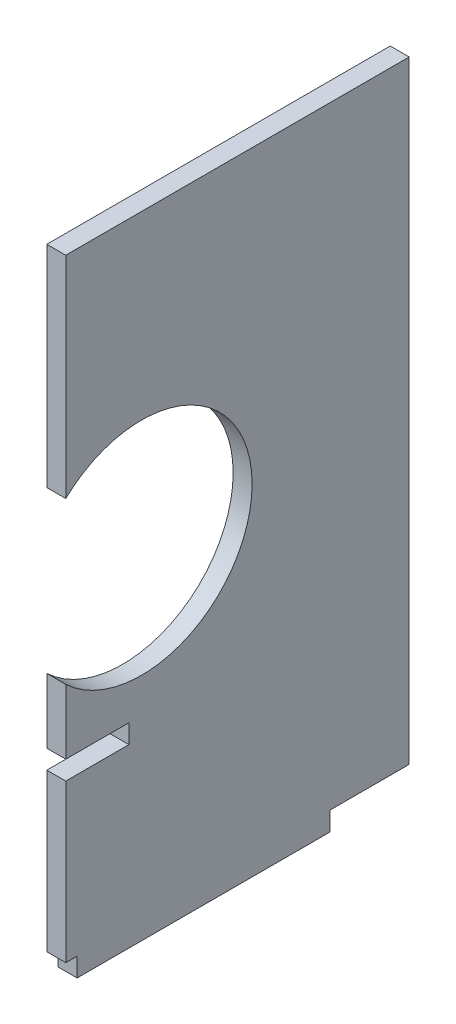
ISO-10303-21;
HEADER;
FILE_DESCRIPTION(('STEP AP214'),'2;1');
FILE_NAME('part.step','',(''),(''),'','','');
FILE_SCHEMA(('AUTOMOTIVE_DESIGN { 1 0 10303 214 1 1 1 1 }'));
ENDSEC;
DATA;
#1=APPLICATION_CONTEXT('core data for automotive mechanical design processes');
#2=APPLICATION_PROTOCOL_DEFINITION('international standard','automotive_design',2000,#1);
#3=PRODUCT_CONTEXT('',#1,'mechanical');
#4=PRODUCT('Part','Part','',(#3));
#5=PRODUCT_RELATED_PRODUCT_CATEGORY('part','',(#4));
#6=PRODUCT_DEFINITION_FORMATION('','',#4);
#7=PRODUCT_DEFINITION_CONTEXT('part definition',#1,'design');
#8=PRODUCT_DEFINITION('design','',#6,#7);
#9=PRODUCT_DEFINITION_SHAPE('','',#8);
#10=(LENGTH_UNIT() NAMED_UNIT(*) SI_UNIT(.MILLI.,.METRE.));
#11=(NAMED_UNIT(*) PLANE_ANGLE_UNIT() SI_UNIT($,.RADIAN.));
#12=(NAMED_UNIT(*) SI_UNIT($,.STERADIAN.) SOLID_ANGLE_UNIT());
#13=UNCERTAINTY_MEASURE_WITH_UNIT(LENGTH_MEASURE(1.E-05),#10,'distance_accuracy_value','');
#14=(GEOMETRIC_REPRESENTATION_CONTEXT(3) GLOBAL_UNCERTAINTY_ASSIGNED_CONTEXT((#13)) GLOBAL_UNIT_ASSIGNED_CONTEXT((#10,
#11,#12)) REPRESENTATION_CONTEXT('',''));
#15=CARTESIAN_POINT('',(0.,0.,0.));
#16=DIRECTION('',(0.,0.,1.));
#17=DIRECTION('',(1.,0.,0.));
#18=AXIS2_PLACEMENT_3D('',#15,#16,#17);
#19=CARTESIAN_POINT('',(3.,-9.42654711631269,59.4756555054512));
#20=DIRECTION('',(0.,-1.,0.));
#21=DIRECTION('',(0.,0.,-1.));
#22=AXIS2_PLACEMENT_3D('',#19,#20,#21);
#23=PLANE('',#22);
#24=DIRECTION('',(0.,0.,1.));
#25=VECTOR('',#24,1.);
#26=CARTESIAN_POINT('',(0.,-9.42654711631269,59.4756555054512));
#27=LINE('',#26,#25);
#28=CARTESIAN_POINT('',(0.,-9.42654711631268,5.10565550545122));
#29=VERTEX_POINT('',#28);
#30=CARTESIAN_POINT('',(0.,-9.42654711631269,59.4756555054512));
#31=VERTEX_POINT('',#30);
#32=EDGE_CURVE('E153',#29,#31,#27,.T.);
#33=ORIENTED_EDGE('',*,*,#32,.T.);
#34=DIRECTION('',(-1.,0.,0.));
#35=VECTOR('',#34,1.);
#36=CARTESIAN_POINT('',(3.,-9.42654711631269,59.4756555054512));
#37=LINE('',#36,#35);
#38=CARTESIAN_POINT('',(3.,-9.42654711631269,59.4756555054512));
#39=VERTEX_POINT('',#38);
#40=EDGE_CURVE('E9',#39,#31,#37,.T.);
#41=ORIENTED_EDGE('',*,*,#40,.F.);
#42=DIRECTION('',(0.,0.,1.));
#43=VECTOR('',#42,1.);
#44=CARTESIAN_POINT('',(3.,-9.42654711631269,59.4756555054512));
#45=LINE('',#44,#43);
#46=CARTESIAN_POINT('',(3.,-9.42654711631268,5.10565550545122));
#47=VERTEX_POINT('',#46);
#48=EDGE_CURVE('E147',#47,#39,#45,.T.);
#49=ORIENTED_EDGE('',*,*,#48,.F.);
#50=DIRECTION('',(-1.,0.,0.));
#51=VECTOR('',#50,1.);
#52=CARTESIAN_POINT('',(3.,-9.42654711631268,5.10565550545122));
#53=LINE('',#52,#51);
#54=EDGE_CURVE('E143',#47,#29,#53,.T.);
#55=ORIENTED_EDGE('',*,*,#54,.T.);
#56=EDGE_LOOP('',(#33,#41,#49,#55));
#57=FACE_BOUND('',#56,.T.);
#58=ADVANCED_FACE('F15',(#57),#23,.F.);
#59=CARTESIAN_POINT('',(3.,-42.7888079134557,59.4756555054512));
#60=DIRECTION('',(0.,0.,-1.));
#61=DIRECTION('',(0.,1.,0.));
#62=AXIS2_PLACEMENT_3D('',#59,#60,#61);
#63=PLANE('',#62);
#64=DIRECTION('',(0.,-1.,0.));
#65=VECTOR('',#64,1.);
#66=CARTESIAN_POINT('',(0.,-42.7888079134557,59.4756555054512));
#67=LINE('',#66,#65);
#68=CARTESIAN_POINT('',(0.,-42.7888079134557,59.4756555054512));
#69=VERTEX_POINT('',#68);
#70=EDGE_CURVE('E149',#31,#69,#67,.T.);
#71=ORIENTED_EDGE('',*,*,#70,.T.);
#72=DIRECTION('',(-1.,0.,0.));
#73=VECTOR('',#72,1.);
#74=CARTESIAN_POINT('',(3.,-42.7888079134557,59.4756555054512));
#75=LINE('',#74,#73);
#76=CARTESIAN_POINT('',(3.,-42.7888079134557,59.4756555054512));
#77=VERTEX_POINT('',#76);
#78=EDGE_CURVE('E23',#77,#69,#75,.T.);
#79=ORIENTED_EDGE('',*,*,#78,.F.);
#80=DIRECTION('',(0.,-1.,0.));
#81=VECTOR('',#80,1.);
#82=CARTESIAN_POINT('',(3.,-42.7888079134557,59.4756555054512));
#83=LINE('',#82,#81);
#84=EDGE_CURVE('E92',#39,#77,#83,.T.);
#85=ORIENTED_EDGE('',*,*,#84,.F.);
#86=ORIENTED_EDGE('',*,*,#40,.T.);
#87=EDGE_LOOP('',(#71,#79,#85,#86));
#88=FACE_BOUND('',#87,.T.);
#89=ADVANCED_FACE('F277',(#88),#63,.F.);
#90=CARTESIAN_POINT('',(3.,-55.5265471163127,47.4756555054512));
#91=DIRECTION('',(-1.,0.,0.));
#92=DIRECTION('',(0.,0.,1.));
#93=AXIS2_PLACEMENT_3D('',#90,#91,#92);
#94=CYLINDRICAL_SURFACE('',#93,17.5);
#95=CARTESIAN_POINT('',(0.,-55.5265471163127,47.4756555054512));
#96=DIRECTION('',(-1.,0.,0.));
#97=DIRECTION('',(0.,0.,1.));
#98=AXIS2_PLACEMENT_3D('',#95,#96,#97);
#99=CIRCLE('',#98,17.5);
#100=CARTESIAN_POINT('',(0.,-68.2642863191697,59.4756555054512));
#101=VERTEX_POINT('',#100);
#102=EDGE_CURVE('E152',#69,#101,#99,.T.);
#103=ORIENTED_EDGE('',*,*,#102,.T.);
#104=DIRECTION('',(-1.,0.,0.));
#105=VECTOR('',#104,1.);
#106=CARTESIAN_POINT('',(3.,-68.2642863191697,59.4756555054512));
#107=LINE('',#106,#105);
#108=CARTESIAN_POINT('',(3.,-68.2642863191697,59.4756555054512));
#109=VERTEX_POINT('',#108);
#110=EDGE_CURVE('E213',#109,#101,#107,.T.);
#111=ORIENTED_EDGE('',*,*,#110,.F.);
#112=CARTESIAN_POINT('',(3.,-55.5265471163127,47.4756555054512));
#113=DIRECTION('',(-1.,0.,0.));
#114=DIRECTION('',(0.,0.,1.));
#115=AXIS2_PLACEMENT_3D('',#112,#113,#114);
#116=CIRCLE('',#115,17.5);
#117=EDGE_CURVE('E221',#77,#109,#116,.T.);
#118=ORIENTED_EDGE('',*,*,#117,.F.);
#119=ORIENTED_EDGE('',*,*,#78,.T.);
#120=EDGE_LOOP('',(#103,#111,#118,#119));
#121=FACE_BOUND('',#120,.T.);
#122=ADVANCED_FACE('F219',(#121),#94,.F.);
#123=CARTESIAN_POINT('',(3.,-78.5265471163127,59.4756555054512));
#124=DIRECTION('',(0.,0.,-1.));
#125=DIRECTION('',(-1.,0.,0.));
#126=AXIS2_PLACEMENT_3D('',#123,#124,#125);
#127=PLANE('',#126);
#128=DIRECTION('',(0.,-1.,0.));
#129=VECTOR('',#128,1.);
#130=CARTESIAN_POINT('',(0.,-78.5265471163127,59.4756555054512));
#131=LINE('',#130,#129);
#132=CARTESIAN_POINT('',(0.,-78.5265471163127,59.4756555054512));
#133=VERTEX_POINT('',#132);
#134=EDGE_CURVE('E156',#101,#133,#131,.T.);
#135=ORIENTED_EDGE('',*,*,#134,.T.);
#136=DIRECTION('',(-1.,0.,0.));
#137=VECTOR('',#136,1.);
#138=CARTESIAN_POINT('',(3.,-78.5265471163127,59.4756555054512));
#139=LINE('',#138,#137);
#140=CARTESIAN_POINT('',(3.,-78.5265471163127,59.4756555054512));
#141=VERTEX_POINT('',#140);
#142=EDGE_CURVE('E210',#141,#133,#139,.T.);
#143=ORIENTED_EDGE('',*,*,#142,.F.);
#144=DIRECTION('',(0.,-1.,0.));
#145=VECTOR('',#144,1.);
#146=CARTESIAN_POINT('',(3.,-78.5265471163127,59.4756555054512));
#147=LINE('',#146,#145);
#148=EDGE_CURVE('E239',#109,#141,#147,.T.);
#149=ORIENTED_EDGE('',*,*,#148,.F.);
#150=ORIENTED_EDGE('',*,*,#110,.T.);
#151=EDGE_LOOP('',(#135,#143,#149,#150));
#152=FACE_BOUND('',#151,.T.);
#153=ADVANCED_FACE('F230',(#152),#127,.F.);
#154=CARTESIAN_POINT('',(3.,-78.5265471163127,59.4756555054512));
#155=DIRECTION('',(0.,1.,0.));
#156=DIRECTION('',(0.,0.,1.));
#157=AXIS2_PLACEMENT_3D('',#154,#155,#156);
#158=PLANE('',#157);
#159=DIRECTION('',(0.,0.,-1.));
#160=VECTOR('',#159,1.);
#161=CARTESIAN_POINT('',(0.,-78.5265471163127,59.4756555054512));
#162=LINE('',#161,#160);
#163=CARTESIAN_POINT('',(0.,-78.5265471163128,49.4756555054512));
#164=VERTEX_POINT('',#163);
#165=EDGE_CURVE('E159',#133,#164,#162,.T.);
#166=ORIENTED_EDGE('',*,*,#165,.T.);
#167=DIRECTION('',(-1.,0.,0.));
#168=VECTOR('',#167,1.);
#169=CARTESIAN_POINT('',(3.,-78.5265471163128,49.4756555054512));
#170=LINE('',#169,#168);
#171=CARTESIAN_POINT('',(3.,-78.5265471163128,49.4756555054512));
#172=VERTEX_POINT('',#171);
#173=EDGE_CURVE('E207',#172,#164,#170,.T.);
#174=ORIENTED_EDGE('',*,*,#173,.F.);
#175=DIRECTION('',(0.,0.,-1.));
#176=VECTOR('',#175,1.);
#177=CARTESIAN_POINT('',(3.,-78.5265471163127,59.4756555054512));
#178=LINE('',#177,#176);
#179=EDGE_CURVE('E236',#141,#172,#178,.T.);
#180=ORIENTED_EDGE('',*,*,#179,.F.);
#181=ORIENTED_EDGE('',*,*,#142,.T.);
#182=EDGE_LOOP('',(#166,#174,#180,#181));
#183=FACE_BOUND('',#182,.T.);
#184=ADVANCED_FACE('F234',(#183),#158,.F.);
#185=CARTESIAN_POINT('',(3.,-78.5265471163127,49.4756555054512));
#186=DIRECTION('',(0.,0.,-1.));
#187=DIRECTION('',(-1.,0.,0.));
#188=AXIS2_PLACEMENT_3D('',#185,#186,#187);
#189=PLANE('',#188);
#190=DIRECTION('',(0.,-1.,0.));
#191=VECTOR('',#190,1.);
#192=CARTESIAN_POINT('',(0.,-78.5265471163127,49.4756555054512));
#193=LINE('',#192,#191);
#194=CARTESIAN_POINT('',(0.,-81.5265471163127,49.4756555054512));
#195=VERTEX_POINT('',#194);
#196=EDGE_CURVE('E162',#164,#195,#193,.T.);
#197=ORIENTED_EDGE('',*,*,#196,.T.);
#198=DIRECTION('',(-1.,0.,0.));
#199=VECTOR('',#198,1.);
#200=CARTESIAN_POINT('',(2.99999999999999,-81.5265471163127,49.4756555054512));
#201=LINE('',#200,#199);
#202=CARTESIAN_POINT('',(2.99999999999999,-81.5265471163127,49.4756555054512));
#203=VERTEX_POINT('',#202);
#204=EDGE_CURVE('E204',#203,#195,#201,.T.);
#205=ORIENTED_EDGE('',*,*,#204,.F.);
#206=DIRECTION('',(0.,-1.,0.));
#207=VECTOR('',#206,1.);
#208=CARTESIAN_POINT('',(3.,-78.5265471163127,49.4756555054512));
#209=LINE('',#208,#207);
#210=EDGE_CURVE('E238',#172,#203,#209,.T.);
#211=ORIENTED_EDGE('',*,*,#210,.F.);
#212=ORIENTED_EDGE('',*,*,#173,.T.);
#213=EDGE_LOOP('',(#197,#205,#211,#212));
#214=FACE_BOUND('',#213,.T.);
#215=ADVANCED_FACE('F290',(#214),#189,.F.);
#216=CARTESIAN_POINT('',(2.99999999999999,-81.5265471163127,49.4756555054512));
#217=DIRECTION('',(0.,-1.,0.));
#218=DIRECTION('',(0.,0.,-1.));
#219=AXIS2_PLACEMENT_3D('',#216,#217,#218);
#220=PLANE('',#219);
#221=DIRECTION('',(0.,0.,1.));
#222=VECTOR('',#221,1.);
#223=CARTESIAN_POINT('',(0.,-81.5265471163127,49.4756555054512));
#224=LINE('',#223,#222);
#225=CARTESIAN_POINT('',(0.,-81.5265471163127,59.4756555054512));
#226=VERTEX_POINT('',#225);
#227=EDGE_CURVE('E165',#195,#226,#224,.T.);
#228=ORIENTED_EDGE('',*,*,#227,.T.);
#229=DIRECTION('',(-1.,0.,0.));
#230=VECTOR('',#229,1.);
#231=CARTESIAN_POINT('',(2.99999999999999,-81.5265471163127,59.4756555054512));
#232=LINE('',#231,#230);
#233=CARTESIAN_POINT('',(2.99999999999999,-81.5265471163127,59.4756555054512));
#234=VERTEX_POINT('',#233);
#235=EDGE_CURVE('E201',#234,#226,#232,.T.);
#236=ORIENTED_EDGE('',*,*,#235,.F.);
#237=DIRECTION('',(0.,0.,1.));
#238=VECTOR('',#237,1.);
#239=CARTESIAN_POINT('',(2.99999999999999,-81.5265471163127,49.4756555054512));
#240=LINE('',#239,#238);
#241=EDGE_CURVE('E241',#203,#234,#240,.T.);
#242=ORIENTED_EDGE('',*,*,#241,.F.);
#243=ORIENTED_EDGE('',*,*,#204,.T.);
#244=EDGE_LOOP('',(#228,#236,#242,#243));
#245=FACE_BOUND('',#244,.T.);
#246=ADVANCED_FACE('F293',(#245),#220,.F.);
#247=CARTESIAN_POINT('',(2.99999999999999,-106.426547116313,59.4756555054512));
#248=DIRECTION('',(0.,0.,-1.));
#249=DIRECTION('',(0.,1.,0.));
#250=AXIS2_PLACEMENT_3D('',#247,#248,#249);
#251=PLANE('',#250);
#252=DIRECTION('',(0.,-1.,0.));
#253=VECTOR('',#252,1.);
#254=CARTESIAN_POINT('',(0.,-106.426547116313,59.4756555054512));
#255=LINE('',#254,#253);
#256=CARTESIAN_POINT('',(0.,-106.426547116313,59.4756555054512));
#257=VERTEX_POINT('',#256);
#258=EDGE_CURVE('E168',#226,#257,#255,.T.);
#259=ORIENTED_EDGE('',*,*,#258,.T.);
#260=DIRECTION('',(-1.,0.,0.));
#261=VECTOR('',#260,1.);
#262=CARTESIAN_POINT('',(2.99999999999999,-106.426547116313,59.4756555054512));
#263=LINE('',#262,#261);
#264=CARTESIAN_POINT('',(2.99999999999999,-106.426547116313,59.4756555054512));
#265=VERTEX_POINT('',#264);
#266=EDGE_CURVE('E198',#265,#257,#263,.T.);
#267=ORIENTED_EDGE('',*,*,#266,.F.);
#268=DIRECTION('',(0.,-1.,0.));
#269=VECTOR('',#268,1.);
#270=CARTESIAN_POINT('',(2.99999999999999,-106.426547116313,59.4756555054512));
#271=LINE('',#270,#269);
#272=EDGE_CURVE('E247',#234,#265,#271,.T.);
#273=ORIENTED_EDGE('',*,*,#272,.F.);
#274=ORIENTED_EDGE('',*,*,#235,.T.);
#275=EDGE_LOOP('',(#259,#267,#273,#274));
#276=FACE_BOUND('',#275,.T.);
#277=ADVANCED_FACE('F297',(#276),#251,.F.);
#278=CARTESIAN_POINT('',(2.99999999999999,-106.426547116313,57.6756555054512));
#279=DIRECTION('',(0.,1.,0.));
#280=DIRECTION('',(0.,0.,1.));
#281=AXIS2_PLACEMENT_3D('',#278,#279,#280);
#282=PLANE('',#281);
#283=DIRECTION('',(0.,0.,-1.));
#284=VECTOR('',#283,1.);
#285=CARTESIAN_POINT('',(0.,-106.426547116313,57.6756555054512));
#286=LINE('',#285,#284);
#287=CARTESIAN_POINT('',(0.,-106.426547116313,57.6756555054512));
#288=VERTEX_POINT('',#287);
#289=EDGE_CURVE('E171',#257,#288,#286,.T.);
#290=ORIENTED_EDGE('',*,*,#289,.T.);
#291=DIRECTION('',(-1.,0.,0.));
#292=VECTOR('',#291,1.);
#293=CARTESIAN_POINT('',(2.99999999999999,-106.426547116313,57.6756555054512));
#294=LINE('',#293,#292);
#295=CARTESIAN_POINT('',(2.99999999999999,-106.426547116313,57.6756555054512));
#296=VERTEX_POINT('',#295);
#297=EDGE_CURVE('E195',#296,#288,#294,.T.);
#298=ORIENTED_EDGE('',*,*,#297,.F.);
#299=DIRECTION('',(0.,0.,-1.));
#300=VECTOR('',#299,1.);
#301=CARTESIAN_POINT('',(2.99999999999999,-106.426547116313,57.6756555054512));
#302=LINE('',#301,#300);
#303=EDGE_CURVE('E249',#265,#296,#302,.T.);
#304=ORIENTED_EDGE('',*,*,#303,.F.);
#305=ORIENTED_EDGE('',*,*,#266,.T.);
#306=EDGE_LOOP('',(#290,#298,#304,#305));
#307=FACE_BOUND('',#306,.T.);
#308=ADVANCED_FACE('F301',(#307),#282,.F.);
#309=CARTESIAN_POINT('',(2.99999999999999,-109.426547116313,57.6756555054512));
#310=DIRECTION('',(0.,0.,-1.));
#311=DIRECTION('',(-1.,0.,0.));
#312=AXIS2_PLACEMENT_3D('',#309,#310,#311);
#313=PLANE('',#312);
#314=DIRECTION('',(0.,-1.,0.));
#315=VECTOR('',#314,1.);
#316=CARTESIAN_POINT('',(0.,-109.426547116313,57.6756555054512));
#317=LINE('',#316,#315);
#318=CARTESIAN_POINT('',(0.,-109.426547116313,57.6756555054512));
#319=VERTEX_POINT('',#318);
#320=EDGE_CURVE('E174',#288,#319,#317,.T.);
#321=ORIENTED_EDGE('',*,*,#320,.T.);
#322=DIRECTION('',(-1.,0.,0.));
#323=VECTOR('',#322,1.);
#324=CARTESIAN_POINT('',(2.99999999999999,-109.426547116313,57.6756555054512));
#325=LINE('',#324,#323);
#326=CARTESIAN_POINT('',(2.99999999999999,-109.426547116313,57.6756555054512));
#327=VERTEX_POINT('',#326);
#328=EDGE_CURVE('E192',#327,#319,#325,.T.);
#329=ORIENTED_EDGE('',*,*,#328,.F.);
#330=DIRECTION('',(0.,-1.,0.));
#331=VECTOR('',#330,1.);
#332=CARTESIAN_POINT('',(2.99999999999999,-109.426547116313,57.6756555054512));
#333=LINE('',#332,#331);
#334=EDGE_CURVE('E251',#296,#327,#333,.T.);
#335=ORIENTED_EDGE('',*,*,#334,.F.);
#336=ORIENTED_EDGE('',*,*,#297,.T.);
#337=EDGE_LOOP('',(#321,#329,#335,#336));
#338=FACE_BOUND('',#337,.T.);
#339=ADVANCED_FACE('F257',(#338),#313,.F.);
#340=CARTESIAN_POINT('',(2.99999999999999,-109.426547116313,17.6756555054512));
#341=DIRECTION('',(0.,1.,0.));
#342=DIRECTION('',(0.,0.,1.));
#343=AXIS2_PLACEMENT_3D('',#340,#341,#342);
#344=PLANE('',#343);
#345=DIRECTION('',(0.,0.,-1.));
#346=VECTOR('',#345,1.);
#347=CARTESIAN_POINT('',(0.,-109.426547116313,17.6756555054512));
#348=LINE('',#347,#346);
#349=CARTESIAN_POINT('',(0.,-109.426547116313,17.6756555054512));
#350=VERTEX_POINT('',#349);
#351=EDGE_CURVE('E177',#319,#350,#348,.T.);
#352=ORIENTED_EDGE('',*,*,#351,.T.);
#353=DIRECTION('',(-1.,0.,0.));
#354=VECTOR('',#353,1.);
#355=CARTESIAN_POINT('',(2.99999999999999,-109.426547116313,17.6756555054512));
#356=LINE('',#355,#354);
#357=CARTESIAN_POINT('',(2.99999999999999,-109.426547116313,17.6756555054512));
#358=VERTEX_POINT('',#357);
#359=EDGE_CURVE('E138',#358,#350,#356,.T.);
#360=ORIENTED_EDGE('',*,*,#359,.F.);
#361=DIRECTION('',(0.,0.,-1.));
#362=VECTOR('',#361,1.);
#363=CARTESIAN_POINT('',(2.99999999999999,-109.426547116313,17.6756555054512));
#364=LINE('',#363,#362);
#365=EDGE_CURVE('E129',#327,#358,#364,.T.);
#366=ORIENTED_EDGE('',*,*,#365,.F.);
#367=ORIENTED_EDGE('',*,*,#328,.T.);
#368=EDGE_LOOP('',(#352,#360,#366,#367));
#369=FACE_BOUND('',#368,.T.);
#370=ADVANCED_FACE('F261',(#369),#344,.F.);
#371=CARTESIAN_POINT('',(2.99999999999999,-106.426547116313,17.6756555054512));
#372=DIRECTION('',(0.,0.,1.));
#373=DIRECTION('',(1.,0.,0.));
#374=AXIS2_PLACEMENT_3D('',#371,#372,#373);
#375=PLANE('',#374);
#376=DIRECTION('',(0.,1.,0.));
#377=VECTOR('',#376,1.);
#378=CARTESIAN_POINT('',(0.,-106.426547116313,17.6756555054512));
#379=LINE('',#378,#377);
#380=CARTESIAN_POINT('',(0.,-106.426547116313,17.6756555054512));
#381=VERTEX_POINT('',#380);
#382=EDGE_CURVE('E137',#350,#381,#379,.T.);
#383=ORIENTED_EDGE('',*,*,#382,.T.);
#384=DIRECTION('',(-1.,0.,0.));
#385=VECTOR('',#384,1.);
#386=CARTESIAN_POINT('',(2.99999999999999,-106.426547116313,17.6756555054512));
#387=LINE('',#386,#385);
#388=CARTESIAN_POINT('',(2.99999999999999,-106.426547116313,17.6756555054512));
#389=VERTEX_POINT('',#388);
#390=EDGE_CURVE('E134',#389,#381,#387,.T.);
#391=ORIENTED_EDGE('',*,*,#390,.F.);
#392=DIRECTION('',(0.,1.,0.));
#393=VECTOR('',#392,1.);
#394=CARTESIAN_POINT('',(2.99999999999999,-106.426547116313,17.6756555054512));
#395=LINE('',#394,#393);
#396=EDGE_CURVE('E123',#358,#389,#395,.T.);
#397=ORIENTED_EDGE('',*,*,#396,.F.);
#398=ORIENTED_EDGE('',*,*,#359,.T.);
#399=EDGE_LOOP('',(#383,#391,#397,#398));
#400=FACE_BOUND('',#399,.T.);
#401=ADVANCED_FACE('F135',(#400),#375,.F.);
#402=CARTESIAN_POINT('',(2.99999999999999,-106.426547116313,5.10565550545121));
#403=DIRECTION('',(0.,1.,0.));
#404=DIRECTION('',(0.,0.,1.));
#405=AXIS2_PLACEMENT_3D('',#402,#403,#404);
#406=PLANE('',#405);
#407=DIRECTION('',(0.,0.,-1.));
#408=VECTOR('',#407,1.);
#409=CARTESIAN_POINT('',(0.,-106.426547116313,5.10565550545121));
#410=LINE('',#409,#408);
#411=CARTESIAN_POINT('',(0.,-106.426547116313,5.10565550545121));
#412=VERTEX_POINT('',#411);
#413=EDGE_CURVE('E78',#381,#412,#410,.T.);
#414=ORIENTED_EDGE('',*,*,#413,.T.);
#415=DIRECTION('',(-1.,0.,0.));
#416=VECTOR('',#415,1.);
#417=CARTESIAN_POINT('',(2.99999999999999,-106.426547116313,5.10565550545121));
#418=LINE('',#417,#416);
#419=CARTESIAN_POINT('',(2.99999999999999,-106.426547116313,5.10565550545121));
#420=VERTEX_POINT('',#419);
#421=EDGE_CURVE('E139',#420,#412,#418,.T.);
#422=ORIENTED_EDGE('',*,*,#421,.F.);
#423=DIRECTION('',(0.,0.,-1.));
#424=VECTOR('',#423,1.);
#425=CARTESIAN_POINT('',(2.99999999999999,-106.426547116313,5.10565550545121));
#426=LINE('',#425,#424);
#427=EDGE_CURVE('E127',#389,#420,#426,.T.);
#428=ORIENTED_EDGE('',*,*,#427,.F.);
#429=ORIENTED_EDGE('',*,*,#390,.T.);
#430=EDGE_LOOP('',(#414,#422,#428,#429));
#431=FACE_BOUND('',#430,.T.);
#432=ADVANCED_FACE('F141',(#431),#406,.F.);
#433=CARTESIAN_POINT('',(3.,-9.42654711631268,5.10565550545122));
#434=DIRECTION('',(0.,0.,1.));
#435=DIRECTION('',(0.,-1.,0.));
#436=AXIS2_PLACEMENT_3D('',#433,#434,#435);
#437=PLANE('',#436);
#438=DIRECTION('',(0.,1.,0.));
#439=VECTOR('',#438,1.);
#440=CARTESIAN_POINT('',(0.,-9.42654711631268,5.10565550545122));
#441=LINE('',#440,#439);
#442=EDGE_CURVE('E84',#412,#29,#441,.T.);
#443=ORIENTED_EDGE('',*,*,#442,.T.);
#444=ORIENTED_EDGE('',*,*,#54,.F.);
#445=DIRECTION('',(0.,1.,0.));
#446=VECTOR('',#445,1.);
#447=CARTESIAN_POINT('',(3.,-9.42654711631268,5.10565550545122));
#448=LINE('',#447,#446);
#449=EDGE_CURVE('E31',#420,#47,#448,.T.);
#450=ORIENTED_EDGE('',*,*,#449,.F.);
#451=ORIENTED_EDGE('',*,*,#421,.T.);
#452=EDGE_LOOP('',(#443,#444,#450,#451));
#453=FACE_BOUND('',#452,.T.);
#454=ADVANCED_FACE('F265',(#453),#437,.F.);
#455=CARTESIAN_POINT('',(3.,-55.5265471163127,47.4756555054512));
#456=DIRECTION('',(-1.,0.,0.));
#457=DIRECTION('',(0.,-1.,0.));
#458=AXIS2_PLACEMENT_3D('',#455,#456,#457);
#459=PLANE('',#458);
#460=ORIENTED_EDGE('',*,*,#48,.T.);
#461=ORIENTED_EDGE('',*,*,#84,.T.);
#462=ORIENTED_EDGE('',*,*,#117,.T.);
#463=ORIENTED_EDGE('',*,*,#148,.T.);
#464=ORIENTED_EDGE('',*,*,#179,.T.);
#465=ORIENTED_EDGE('',*,*,#210,.T.);
#466=ORIENTED_EDGE('',*,*,#241,.T.);
#467=ORIENTED_EDGE('',*,*,#272,.T.);
#468=ORIENTED_EDGE('',*,*,#303,.T.);
#469=ORIENTED_EDGE('',*,*,#334,.T.);
#470=ORIENTED_EDGE('',*,*,#365,.T.);
#471=ORIENTED_EDGE('',*,*,#396,.T.);
#472=ORIENTED_EDGE('',*,*,#427,.T.);
#473=ORIENTED_EDGE('',*,*,#449,.T.);
#474=EDGE_LOOP('',(#460,#461,#462,#463,#464,#465,#466,#467,#468,#469,#470,#471,#472,#473));
#475=FACE_BOUND('',#474,.T.);
#476=ADVANCED_FACE('F125',(#475),#459,.F.);
#477=CARTESIAN_POINT('',(0.,-55.5265471163127,47.4756555054512));
#478=DIRECTION('',(-1.,0.,0.));
#479=DIRECTION('',(0.,-1.,0.));
#480=AXIS2_PLACEMENT_3D('',#477,#478,#479);
#481=PLANE('',#480);
#482=ORIENTED_EDGE('',*,*,#32,.F.);
#483=ORIENTED_EDGE('',*,*,#442,.F.);
#484=ORIENTED_EDGE('',*,*,#413,.F.);
#485=ORIENTED_EDGE('',*,*,#382,.F.);
#486=ORIENTED_EDGE('',*,*,#351,.F.);
#487=ORIENTED_EDGE('',*,*,#320,.F.);
#488=ORIENTED_EDGE('',*,*,#289,.F.);
#489=ORIENTED_EDGE('',*,*,#258,.F.);
#490=ORIENTED_EDGE('',*,*,#227,.F.);
#491=ORIENTED_EDGE('',*,*,#196,.F.);
#492=ORIENTED_EDGE('',*,*,#165,.F.);
#493=ORIENTED_EDGE('',*,*,#134,.F.);
#494=ORIENTED_EDGE('',*,*,#102,.F.);
#495=ORIENTED_EDGE('',*,*,#70,.F.);
#496=EDGE_LOOP('',(#482,#483,#484,#485,#486,#487,#488,#489,#490,#491,#492,#493,#494,#495));
#497=FACE_BOUND('',#496,.T.);
#498=ADVANCED_FACE('F225',(#497),#481,.T.);
#499=CLOSED_SHELL('',(#58,#89,#122,#153,#184,#215,#246,#277,#308,#339,#370,#401,#432,#454,#476,#498));
#500=MANIFOLD_SOLID_BREP('B1',#499);
#501=ADVANCED_BREP_SHAPE_REPRESENTATION('',(#18,#500),#14);
#502=SHAPE_DEFINITION_REPRESENTATION(#9,#501);
ENDSEC;
END-ISO-10303-21;
